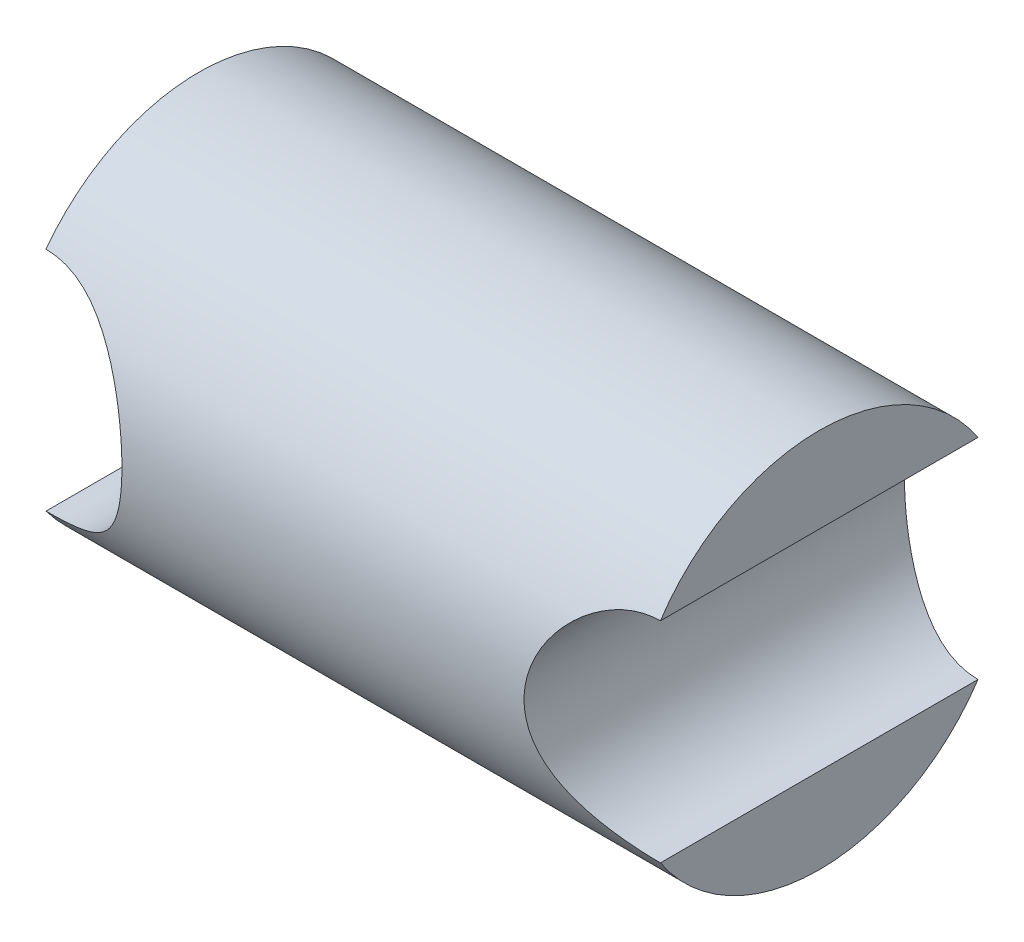
ISO-10303-21;
HEADER;
FILE_DESCRIPTION(('STEP AP214'),'2;1');
FILE_NAME('part.step','',(''),(''),'','','');
FILE_SCHEMA(('AUTOMOTIVE_DESIGN { 1 0 10303 214 1 1 1 1 }'));
ENDSEC;
DATA;
#1=APPLICATION_CONTEXT('core data for automotive mechanical design processes');
#2=APPLICATION_PROTOCOL_DEFINITION('international standard','automotive_design',2000,#1);
#3=PRODUCT_CONTEXT('',#1,'mechanical');
#4=PRODUCT('Part','Part','',(#3));
#5=PRODUCT_RELATED_PRODUCT_CATEGORY('part','',(#4));
#6=PRODUCT_DEFINITION_FORMATION('','',#4);
#7=PRODUCT_DEFINITION_CONTEXT('part definition',#1,'design');
#8=PRODUCT_DEFINITION('design','',#6,#7);
#9=PRODUCT_DEFINITION_SHAPE('','',#8);
#10=(LENGTH_UNIT() NAMED_UNIT(*) SI_UNIT(.MILLI.,.METRE.));
#11=(NAMED_UNIT(*) PLANE_ANGLE_UNIT() SI_UNIT($,.RADIAN.));
#12=(NAMED_UNIT(*) SI_UNIT($,.STERADIAN.) SOLID_ANGLE_UNIT());
#13=UNCERTAINTY_MEASURE_WITH_UNIT(LENGTH_MEASURE(1.E-05),#10,'distance_accuracy_value','');
#14=(GEOMETRIC_REPRESENTATION_CONTEXT(3) GLOBAL_UNCERTAINTY_ASSIGNED_CONTEXT((#13)) GLOBAL_UNIT_ASSIGNED_CONTEXT((#10,
#11,#12)) REPRESENTATION_CONTEXT('',''));
#15=CARTESIAN_POINT('',(0.,0.,0.));
#16=DIRECTION('',(0.,0.,1.));
#17=DIRECTION('',(1.,0.,0.));
#18=AXIS2_PLACEMENT_3D('',#15,#16,#17);
#19=CARTESIAN_POINT('',(75.,0.,0.));
#20=DIRECTION('',(-1.,0.,0.));
#21=DIRECTION('',(0.,0.,-1.));
#22=AXIS2_PLACEMENT_3D('',#19,#20,#21);
#23=CYLINDRICAL_SURFACE('',#22,23.);
#24=CARTESIAN_POINT('',(75.,-12.6701406368447,-19.1955082309007));
#25=CARTESIAN_POINT('',(74.8369294760517,-12.6703725699019,-19.1953515760814));
#26=CARTESIAN_POINT('',(74.6738765209561,-12.6674524483349,-19.197283010189));
#27=CARTESIAN_POINT('',(74.348114196428,-12.6553313683796,-19.2052770578598));
#28=CARTESIAN_POINT('',(74.1854048090592,-12.6461307464331,-19.2113394501303));
#29=CARTESIAN_POINT('',(73.6985568130561,-12.6091674984424,-19.2356394955028));
#30=CARTESIAN_POINT('',(73.3753673887891,-12.5720438529932,-19.2599898902889));
#31=CARTESIAN_POINT('',(72.7365402763044,-12.4737340733277,-19.3238021572105));
#32=CARTESIAN_POINT('',(72.4208661148813,-12.4127137929539,-19.3631598233005));
#33=CARTESIAN_POINT('',(71.7969146387665,-12.2674364029484,-19.4555236461787));
#34=CARTESIAN_POINT('',(71.4886384537322,-12.1831757687916,-19.508531873067));
#35=CARTESIAN_POINT('',(70.8822749260622,-11.9927037483855,-19.626195030197));
#36=CARTESIAN_POINT('',(70.5841607617617,-11.8865563719188,-19.6908159288654));
#37=CARTESIAN_POINT('',(69.9986688477942,-11.6532194229001,-19.8297983823622));
#38=CARTESIAN_POINT('',(69.711290885988,-11.5260302663873,-19.9041597445955));
#39=CARTESIAN_POINT('',(69.1479533911269,-11.2513953328332,-20.0606858463557));
#40=CARTESIAN_POINT('',(68.8720148260924,-11.1039143277573,-20.1428640782016));
#41=CARTESIAN_POINT('',(68.3330510519983,-10.7898212572092,-20.3128443216903));
#42=CARTESIAN_POINT('',(68.0700271254207,-10.623207297211,-20.400646889868));
#43=CARTESIAN_POINT('',(67.5320472002041,-10.2540885503507,-20.5888506364099));
#44=CARTESIAN_POINT('',(67.2585425992587,-10.0496599361237,-20.6896318906438));
#45=CARTESIAN_POINT('',(66.7292877351354,-9.61977777649522,-20.8929752916031));
#46=CARTESIAN_POINT('',(66.4735385187119,-9.39432299334598,-20.9955375428808));
#47=CARTESIAN_POINT('',(65.9807669787859,-8.92328506865594,-21.2000218786104));
#48=CARTESIAN_POINT('',(65.743753377776,-8.67769265904466,-21.3019436447907));
#49=CARTESIAN_POINT('',(65.2898249129469,-8.16756587392657,-21.5026970494471));
#50=CARTESIAN_POINT('',(65.0729035275221,-7.90303769443529,-21.6015296836552));
#51=CARTESIAN_POINT('',(64.6422291135284,-7.33203190684531,-21.8023099506229));
#52=CARTESIAN_POINT('',(64.4304217535566,-7.02390983191719,-21.9037708258536));
#53=CARTESIAN_POINT('',(64.0337472676137,-6.38801941808006,-22.0975945369596));
#54=CARTESIAN_POINT('',(63.8488821297613,-6.06024963184464,-22.1899567012607));
#55=CARTESIAN_POINT('',(63.5080953831817,-5.38722484606739,-22.3628807856803));
#56=CARTESIAN_POINT('',(63.3521577454197,-5.0419796656428,-22.4434492355694));
#57=CARTESIAN_POINT('',(63.0710282172252,-4.336284584781,-22.590406469527));
#58=CARTESIAN_POINT('',(62.9458322379202,-3.97583671389746,-22.6567971391942));
#59=CARTESIAN_POINT('',(62.7369692624769,-3.2730161720505,-22.768471919152));
#60=CARTESIAN_POINT('',(62.6507238985723,-2.93161423371946,-22.8150475607307));
#61=CARTESIAN_POINT('',(62.5067491610129,-2.24114936007302,-22.8931849232233));
#62=CARTESIAN_POINT('',(62.4490183550609,-1.89208681047315,-22.9247473982513));
#63=CARTESIAN_POINT('',(62.3629458561969,-1.189506975912,-22.9719167496449));
#64=CARTESIAN_POINT('',(62.3345856510173,-0.835992639322882,-22.9875336763901));
#65=CARTESIAN_POINT('',(62.3076304049422,-0.127498319987761,-23.002374838167));
#66=CARTESIAN_POINT('',(62.3090329698213,0.22748154256914,-23.0016003917803));
#67=CARTESIAN_POINT('',(62.3398484328987,0.898227363427973,-22.9846384450275));
#68=CARTESIAN_POINT('',(62.3662885407636,1.21417673806282,-22.9700867913281));
#69=CARTESIAN_POINT('',(62.4426174189269,1.84235186680296,-22.9282534062329));
#70=CARTESIAN_POINT('',(62.4925041647497,2.15457794000675,-22.900972773909));
#71=CARTESIAN_POINT('',(62.6151403614973,2.77318369984825,-22.8343217506064));
#72=CARTESIAN_POINT('',(62.6878902173517,3.07956328283655,-22.794951145502));
#73=CARTESIAN_POINT('',(62.8554564097879,3.68454083274565,-22.7050147392627));
#74=CARTESIAN_POINT('',(62.9502735971798,3.98313849913948,-22.6544485064819));
#75=CARTESIAN_POINT('',(63.1620685889228,4.5737342542714,-22.5426746053772));
#76=CARTESIAN_POINT('',(63.2792559968547,4.86563804583655,-22.4813667773894));
#77=CARTESIAN_POINT('',(63.5341068521919,5.43824086938055,-22.3497616859956));
#78=CARTESIAN_POINT('',(63.6717701942376,5.71893995900412,-22.2794644688451));
#79=CARTESIAN_POINT('',(63.9664966586428,6.26788151321782,-22.1313012430599));
#80=CARTESIAN_POINT('',(64.1235608783954,6.53612327198848,-22.0534348063323));
#81=CARTESIAN_POINT('',(64.4560739447837,7.05915349220217,-21.8916269153879));
#82=CARTESIAN_POINT('',(64.631529396589,7.31393707042162,-21.8076832819308));
#83=CARTESIAN_POINT('',(65.0195863667303,7.83567958376827,-21.6260582919788));
#84=CARTESIAN_POINT('',(65.2341534660231,8.10100199097447,-21.5278703087243));
#85=CARTESIAN_POINT('',(65.6832934450007,8.6128356989984,-21.3282567873788));
#86=CARTESIAN_POINT('',(65.9178677882192,8.859345621176,-21.2268310127829));
#87=CARTESIAN_POINT('',(66.4061505829152,9.33282750610117,-21.0229599570844));
#88=CARTESIAN_POINT('',(66.6598813984113,9.55977594909528,-20.9205136094736));
#89=CARTESIAN_POINT('',(67.1851465094215,9.99280595101813,-20.7171681348332));
#90=CARTESIAN_POINT('',(67.4566810075925,10.1988872723514,-20.6162690254318));
#91=CARTESIAN_POINT('',(68.0416744355119,10.606675542797,-20.4096854613166));
#92=CARTESIAN_POINT('',(68.3567081972336,10.8063259115961,-20.3043855537698));
#93=CARTESIAN_POINT('',(69.0052598965241,11.1780983946785,-20.1021125366637));
#94=CARTESIAN_POINT('',(69.3387805034574,11.3502165194927,-20.0051406347879));
#95=CARTESIAN_POINT('',(70.0216322363026,11.6647971440948,-19.8233560250293));
#96=CARTESIAN_POINT('',(70.3709202163616,11.8073352306421,-19.7385125023719));
#97=CARTESIAN_POINT('',(71.0838159179697,12.0614765958226,-19.584252176133));
#98=CARTESIAN_POINT('',(71.4474178326634,12.1730922742804,-19.5148291911666));
#99=CARTESIAN_POINT('',(72.0737354153136,12.3346959962137,-19.412918156132));
#100=CARTESIAN_POINT('',(72.3335288024108,12.393104332667,-19.3756172010098));
#101=CARTESIAN_POINT('',(72.8574324774516,12.4935856461336,-19.3109781771066));
#102=CARTESIAN_POINT('',(73.1215415092359,12.5356632912879,-19.2836372613779));
#103=CARTESIAN_POINT('',(73.6538535999065,12.6032043638705,-19.239567873273));
#104=CARTESIAN_POINT('',(73.9220689039334,12.6285998449352,-19.2228828096899));
#105=CARTESIAN_POINT('',(74.4601865058924,12.6622797639718,-19.2006959954634));
#106=CARTESIAN_POINT('',(74.7300897013463,12.6705541530702,-19.1952008125208));
#107=CARTESIAN_POINT('',(75.,12.6701406368447,-19.1955082309007));
#108=B_SPLINE_CURVE_WITH_KNOTS('',3,(#24,#25,#26,#27,#28,#29,#30,#31,#32,#33,#34,#35,#36,#37,
#38,#39,#40,#41,#42,#43,#44,#45,#46,#47,#48,#49,#50,#51,#52,#53,#54,#55,#56,#57,#58,#59,#60,#61,
#62,#63,#64,#65,#66,#67,#68,#69,#70,#71,#72,#73,#74,#75,#76,#77,#78,#79,#80,#81,#82,#83,#84,#85,
#86,#87,#88,#89,#90,#91,#92,#93,#94,#95,#96,#97,#98,#99,#100,#101,#102,#103,#104,#105,#106,
#107),.UNSPECIFIED.,.F.,.F.,(4,2,2,2,2,2,2,2,2,2,2,2,2,2,2,2,2,2,2,2,2,2,2,2,2,2,2,2,2,2,2,2,2,
2,2,2,2,2,2,2,2,4),(0.,0.489121318111132,0.978216436401427,1.95541754270308,2.9259533038266,
3.89663633293911,4.86451978329434,5.83238409888975,6.8019504076495,7.77161280480903,
8.83858314847981,9.90561634120732,10.9731434080519,12.0403227497723,13.2010781423334,
14.3619191459554,15.5221149812596,16.6821564180704,17.7462528188045,18.8102957641309,
19.8736676350518,20.9369539647959,21.8879851064596,22.8389341474032,23.7899000315987,
24.7409025865382,25.7012969313515,26.6616863345961,27.6221300862876,28.5829199688025,
29.6470181256879,30.7111941884156,31.7766324165046,32.8420827744348,34.0032598284113,
35.1646049868051,36.3229449551696,37.4808197569528,38.2868059949857,39.0925616712337,
39.9015791658945,40.7110713622282),.UNSPECIFIED.);
#109=CARTESIAN_POINT('',(75.,-12.6701406368447,-19.1955082309007));
#110=VERTEX_POINT('',#109);
#111=CARTESIAN_POINT('',(75.,12.6701406368447,-19.1955082309007));
#112=VERTEX_POINT('',#111);
#113=EDGE_CURVE('E91',#110,#112,#108,.T.);
#114=ORIENTED_EDGE('',*,*,#113,.F.);
#115=CARTESIAN_POINT('',(75.,0.,0.));
#116=DIRECTION('',(-1.,0.,0.));
#117=DIRECTION('',(0.,0.,1.));
#118=AXIS2_PLACEMENT_3D('',#115,#116,#117);
#119=CIRCLE('',#118,23.);
#120=CARTESIAN_POINT('',(75.,-12.6701406368447,19.1955082309007));
#121=VERTEX_POINT('',#120);
#122=EDGE_CURVE('E45',#110,#121,#119,.T.);
#123=ORIENTED_EDGE('',*,*,#122,.T.);
#124=CARTESIAN_POINT('',(75.,-12.6701406368447,19.1955082309007));
#125=CARTESIAN_POINT('',(74.8369294760517,-12.6703725699019,19.1953515760814));
#126=CARTESIAN_POINT('',(74.6738765209561,-12.6674524483349,19.197283010189));
#127=CARTESIAN_POINT('',(74.348114196428,-12.6553313683796,19.2052770578598));
#128=CARTESIAN_POINT('',(74.1854048090592,-12.6461307464331,19.2113394501303));
#129=CARTESIAN_POINT('',(73.6985568130561,-12.6091674984424,19.2356394955028));
#130=CARTESIAN_POINT('',(73.3753673887891,-12.5720438529932,19.2599898902889));
#131=CARTESIAN_POINT('',(72.7365402763044,-12.4737340733277,19.3238021572105));
#132=CARTESIAN_POINT('',(72.4208661148813,-12.4127137929539,19.3631598233005));
#133=CARTESIAN_POINT('',(71.7969146387665,-12.2674364029484,19.4555236461787));
#134=CARTESIAN_POINT('',(71.4886384537322,-12.1831757687916,19.508531873067));
#135=CARTESIAN_POINT('',(70.8822749260622,-11.9927037483855,19.626195030197));
#136=CARTESIAN_POINT('',(70.5841607617617,-11.8865563719188,19.6908159288654));
#137=CARTESIAN_POINT('',(69.9986688477942,-11.6532194229001,19.8297983823622));
#138=CARTESIAN_POINT('',(69.711290885988,-11.5260302663873,19.9041597445955));
#139=CARTESIAN_POINT('',(69.1479533911269,-11.2513953328332,20.0606858463557));
#140=CARTESIAN_POINT('',(68.8720148260924,-11.1039143277573,20.1428640782016));
#141=CARTESIAN_POINT('',(68.3330510519983,-10.7898212572092,20.3128443216903));
#142=CARTESIAN_POINT('',(68.0700271254207,-10.623207297211,20.400646889868));
#143=CARTESIAN_POINT('',(67.5320472002041,-10.2540885503507,20.5888506364099));
#144=CARTESIAN_POINT('',(67.2585425992587,-10.0496599361237,20.6896318906438));
#145=CARTESIAN_POINT('',(66.7292877351354,-9.61977777649522,20.8929752916031));
#146=CARTESIAN_POINT('',(66.4735385187119,-9.39432299334598,20.9955375428808));
#147=CARTESIAN_POINT('',(65.9807669787859,-8.92328506865594,21.2000218786104));
#148=CARTESIAN_POINT('',(65.743753377776,-8.67769265904466,21.3019436447907));
#149=CARTESIAN_POINT('',(65.2898249129469,-8.16756587392657,21.5026970494471));
#150=CARTESIAN_POINT('',(65.0729035275221,-7.90303769443529,21.6015296836552));
#151=CARTESIAN_POINT('',(64.6422291135284,-7.33203190684531,21.8023099506229));
#152=CARTESIAN_POINT('',(64.4304217535566,-7.02390983191719,21.9037708258536));
#153=CARTESIAN_POINT('',(64.0337472676137,-6.38801941808006,22.0975945369596));
#154=CARTESIAN_POINT('',(63.8488821297613,-6.06024963184464,22.1899567012607));
#155=CARTESIAN_POINT('',(63.5080953831817,-5.38722484606739,22.3628807856803));
#156=CARTESIAN_POINT('',(63.3521577454197,-5.0419796656428,22.4434492355694));
#157=CARTESIAN_POINT('',(63.0710282172252,-4.336284584781,22.590406469527));
#158=CARTESIAN_POINT('',(62.9458322379202,-3.97583671389746,22.6567971391942));
#159=CARTESIAN_POINT('',(62.7369692624769,-3.2730161720505,22.768471919152));
#160=CARTESIAN_POINT('',(62.6507238985723,-2.93161423371946,22.8150475607307));
#161=CARTESIAN_POINT('',(62.5067491610129,-2.24114936007302,22.8931849232233));
#162=CARTESIAN_POINT('',(62.4490183550609,-1.89208681047315,22.9247473982513));
#163=CARTESIAN_POINT('',(62.3629458561969,-1.189506975912,22.9719167496449));
#164=CARTESIAN_POINT('',(62.3345856510173,-0.835992639322882,22.9875336763901));
#165=CARTESIAN_POINT('',(62.3076304049422,-0.127498319987761,23.002374838167));
#166=CARTESIAN_POINT('',(62.3090329698213,0.22748154256914,23.0016003917803));
#167=CARTESIAN_POINT('',(62.3398484328987,0.898227363427973,22.9846384450275));
#168=CARTESIAN_POINT('',(62.3662885407636,1.21417673806282,22.9700867913281));
#169=CARTESIAN_POINT('',(62.4426174189269,1.84235186680296,22.9282534062329));
#170=CARTESIAN_POINT('',(62.4925041647497,2.15457794000675,22.900972773909));
#171=CARTESIAN_POINT('',(62.6151403614973,2.77318369984825,22.8343217506064));
#172=CARTESIAN_POINT('',(62.6878902173517,3.07956328283655,22.794951145502));
#173=CARTESIAN_POINT('',(62.8554564097879,3.68454083274565,22.7050147392627));
#174=CARTESIAN_POINT('',(62.9502735971798,3.98313849913948,22.6544485064819));
#175=CARTESIAN_POINT('',(63.1620685889228,4.5737342542714,22.5426746053772));
#176=CARTESIAN_POINT('',(63.2792559968547,4.86563804583655,22.4813667773894));
#177=CARTESIAN_POINT('',(63.5341068521919,5.43824086938055,22.3497616859956));
#178=CARTESIAN_POINT('',(63.6717701942376,5.71893995900412,22.2794644688451));
#179=CARTESIAN_POINT('',(63.9664966586428,6.26788151321782,22.1313012430599));
#180=CARTESIAN_POINT('',(64.1235608783954,6.53612327198848,22.0534348063323));
#181=CARTESIAN_POINT('',(64.4560739447837,7.05915349220217,21.8916269153879));
#182=CARTESIAN_POINT('',(64.631529396589,7.31393707042162,21.8076832819308));
#183=CARTESIAN_POINT('',(65.0195863667303,7.83567958376827,21.6260582919788));
#184=CARTESIAN_POINT('',(65.2341534660231,8.10100199097447,21.5278703087243));
#185=CARTESIAN_POINT('',(65.6832934450007,8.6128356989984,21.3282567873788));
#186=CARTESIAN_POINT('',(65.9178677882192,8.859345621176,21.2268310127829));
#187=CARTESIAN_POINT('',(66.4061505829152,9.33282750610117,21.0229599570844));
#188=CARTESIAN_POINT('',(66.6598813984113,9.55977594909528,20.9205136094736));
#189=CARTESIAN_POINT('',(67.1851465094215,9.99280595101813,20.7171681348332));
#190=CARTESIAN_POINT('',(67.4566810075925,10.1988872723514,20.6162690254318));
#191=CARTESIAN_POINT('',(68.0416744355119,10.606675542797,20.4096854613166));
#192=CARTESIAN_POINT('',(68.3567081972336,10.8063259115961,20.3043855537698));
#193=CARTESIAN_POINT('',(69.0052598965241,11.1780983946785,20.1021125366637));
#194=CARTESIAN_POINT('',(69.3387805034574,11.3502165194927,20.0051406347879));
#195=CARTESIAN_POINT('',(70.0216322363026,11.6647971440948,19.8233560250293));
#196=CARTESIAN_POINT('',(70.3709202163616,11.8073352306421,19.7385125023719));
#197=CARTESIAN_POINT('',(71.0838159179697,12.0614765958226,19.584252176133));
#198=CARTESIAN_POINT('',(71.4474178326634,12.1730922742804,19.5148291911666));
#199=CARTESIAN_POINT('',(72.0737354153136,12.3346959962137,19.412918156132));
#200=CARTESIAN_POINT('',(72.3335288024108,12.393104332667,19.3756172010098));
#201=CARTESIAN_POINT('',(72.8574324774516,12.4935856461336,19.3109781771066));
#202=CARTESIAN_POINT('',(73.1215415092359,12.5356632912879,19.2836372613779));
#203=CARTESIAN_POINT('',(73.6538535999065,12.6032043638705,19.239567873273));
#204=CARTESIAN_POINT('',(73.9220689039334,12.6285998449352,19.2228828096899));
#205=CARTESIAN_POINT('',(74.4601865058924,12.6622797639718,19.2006959954634));
#206=CARTESIAN_POINT('',(74.7300897013463,12.6705541530702,19.1952008125208));
#207=CARTESIAN_POINT('',(75.,12.6701406368447,19.1955082309007));
#208=B_SPLINE_CURVE_WITH_KNOTS('',3,(#124,#125,#126,#127,#128,#129,#130,#131,#132,#133,#134,
#135,#136,#137,#138,#139,#140,#141,#142,#143,#144,#145,#146,#147,#148,#149,#150,#151,#152,#153,
#154,#155,#156,#157,#158,#159,#160,#161,#162,#163,#164,#165,#166,#167,#168,#169,#170,#171,#172,
#173,#174,#175,#176,#177,#178,#179,#180,#181,#182,#183,#184,#185,#186,#187,#188,#189,#190,#191,
#192,#193,#194,#195,#196,#197,#198,#199,#200,#201,#202,#203,#204,#205,#206,#207),.UNSPECIFIED.,
.F.,.F.,(4,2,2,2,2,2,2,2,2,2,2,2,2,2,2,2,2,2,2,2,2,2,2,2,2,2,2,2,2,2,2,2,2,2,2,2,2,2,2,2,2,4),
(0.,0.489121318111132,0.978216436401427,1.95541754270308,2.9259533038266,3.89663633293911,
4.86451978329434,5.83238409888975,6.8019504076495,7.77161280480903,8.83858314847981,
9.90561634120732,10.9731434080519,12.0403227497723,13.2010781423334,14.3619191459554,
15.5221149812596,16.6821564180704,17.7462528188045,18.8102957641309,19.8736676350518,
20.9369539647959,21.8879851064596,22.8389341474032,23.7899000315987,24.7409025865382,
25.7012969313515,26.6616863345961,27.6221300862876,28.5829199688025,29.6470181256879,
30.7111941884156,31.7766324165046,32.8420827744348,34.0032598284113,35.1646049868051,
36.3229449551696,37.4808197569528,38.2868059949857,39.0925616712337,39.9015791658945,
40.7110713622282),.UNSPECIFIED.);
#209=CARTESIAN_POINT('',(75.,12.6701406368447,19.1955082309007));
#210=VERTEX_POINT('',#209);
#211=EDGE_CURVE('E115',#121,#210,#208,.T.);
#212=ORIENTED_EDGE('',*,*,#211,.T.);
#213=EDGE_CURVE('E11',#210,#112,#119,.T.);
#214=ORIENTED_EDGE('',*,*,#213,.T.);
#215=EDGE_LOOP('',(#114,#123,#212,#214));
#216=FACE_BOUND('',#215,.T.);
#217=CARTESIAN_POINT('',(0.,13.7098613613582,18.4672602584232));
#218=CARTESIAN_POINT('',(0.173631173285071,13.7098634078061,18.467254338337));
#219=CARTESIAN_POINT('',(0.347235637013716,13.7065620587391,18.4697101369709));
#220=CARTESIAN_POINT('',(0.694045896536872,13.6933818638141,18.4794857007419));
#221=CARTESIAN_POINT('',(0.867251718877372,13.6835034694398,18.4868051320133));
#222=CARTESIAN_POINT('',(1.38537422906297,13.6440775478072,18.515946852298));
#223=CARTESIAN_POINT('',(1.72921438733528,13.604739128532,18.5449528521163));
#224=CARTESIAN_POINT('',(2.40822553040273,13.5010313139217,18.6205850801256));
#225=CARTESIAN_POINT('',(2.74344355265676,13.4368621981128,18.6670702420765));
#226=CARTESIAN_POINT('',(3.40578235037971,13.2844441882134,18.7758434399975));
#227=CARTESIAN_POINT('',(3.73290151999934,13.1961905596721,18.8381345828838));
#228=CARTESIAN_POINT('',(4.3759137817575,12.9970969426961,18.9760385579418));
#229=CARTESIAN_POINT('',(4.69184366393033,12.8863410250492,19.0516016663515));
#230=CARTESIAN_POINT('',(5.31221679442057,12.643249032975,19.2137878061221));
#231=CARTESIAN_POINT('',(5.61666038092688,12.5109135945211,19.3004105115275));
#232=CARTESIAN_POINT('',(6.51252017122838,12.0824557962526,19.57367667907));
#233=CARTESIAN_POINT('',(7.08549617289716,11.7551860317354,19.7734975682965));
#234=CARTESIAN_POINT('',(7.93442838314745,11.1866002862225,20.0976467929225));
#235=CARTESIAN_POINT('',(8.23018696835755,10.9707832764498,20.2165267858857));
#236=CARTESIAN_POINT('',(8.80310434782671,10.5166125897946,20.4564595672112));
#237=CARTESIAN_POINT('',(9.08026207629133,10.2782576234111,20.5775124795749));
#238=CARTESIAN_POINT('',(9.61489558964681,9.77996448325967,20.8189574900027));
#239=CARTESIAN_POINT('',(9.87236521324642,9.52001960570189,20.9393493703484));
#240=CARTESIAN_POINT('',(10.3664180174016,8.9795168082751,21.1767657457066));
#241=CARTESIAN_POINT('',(10.6030001639969,8.69895786923851,21.2937900738273));
#242=CARTESIAN_POINT('',(11.0779929135483,8.08726456191373,21.5340493952516));
#243=CARTESIAN_POINT('',(11.3139136966804,7.75392630267136,21.6566180517658));
#244=CARTESIAN_POINT('',(11.7565624619767,7.06478902630954,21.8911221421538));
#245=CARTESIAN_POINT('',(11.9632878239786,6.70898799739515,22.0030566213617));
#246=CARTESIAN_POINT('',(12.3451910743867,5.97718746974276,22.2130145776261));
#247=CARTESIAN_POINT('',(12.5203889942287,5.60120099472727,22.3110468791878));
#248=CARTESIAN_POINT('',(12.8370793232721,4.83143983789782,22.4902924455207));
#249=CARTESIAN_POINT('',(12.9785771864519,4.43766804672712,22.5715084315468));
#250=CARTESIAN_POINT('',(13.2140123667437,3.67349794390084,22.7077413290066));
#251=CARTESIAN_POINT('',(13.3111799565697,3.3044058786306,22.7645084676913));
#252=CARTESIAN_POINT('',(13.4746887674125,2.55720063302673,22.8605018787111));
#253=CARTESIAN_POINT('',(13.5410317582259,2.1790879719221,22.8997291580935));
#254=CARTESIAN_POINT('',(13.6417947238916,1.41745741401439,22.9594559782168));
#255=CARTESIAN_POINT('',(13.6762391890417,1.03394389381358,22.9799698860874));
#256=CARTESIAN_POINT('',(13.7127063179883,0.264847164097725,23.0016910430112));
#257=CARTESIAN_POINT('',(13.7147322168449,-0.120735835061872,23.0029002184905));
#258=CARTESIAN_POINT('',(13.6880876497439,-0.843042781843045,22.9870262050703));
#259=CARTESIAN_POINT('',(13.6631499754101,-1.17996144319744,22.9721674066167));
#260=CARTESIAN_POINT('',(13.5886409132091,-1.85006950685503,22.9279296787651));
#261=CARTESIAN_POINT('',(13.539072028353,-2.1832592845684,22.8985522247472));
#262=CARTESIAN_POINT('',(13.4159198439374,-2.84362915367209,22.8259531597093));
#263=CARTESIAN_POINT('',(13.3423358109881,-3.17080906120684,22.7827311258955));
#264=CARTESIAN_POINT('',(13.1720112821305,-3.81707992025708,22.6834036073774));
#265=CARTESIAN_POINT('',(13.075269835987,-4.13617053924446,22.6272975939992));
#266=CARTESIAN_POINT('',(12.858992709608,-4.7663698137956,22.5030112829041));
#267=CARTESIAN_POINT('',(12.7393199439757,-5.07741700267347,22.4347585553987));
#268=CARTESIAN_POINT('',(12.4787154780764,-5.68789226565015,22.2878097558823));
#269=CARTESIAN_POINT('',(12.337783967387,-5.98732044333295,22.2091137770011));
#270=CARTESIAN_POINT('',(12.035811374531,-6.57329436262611,22.0427896379089));
#271=CARTESIAN_POINT('',(11.8747683129651,-6.85983883242819,21.9551605986533));
#272=CARTESIAN_POINT('',(11.5337068982145,-7.41897353004722,21.772582511671));
#273=CARTESIAN_POINT('',(11.3536865821777,-7.69156231006116,21.6776327070177));
#274=CARTESIAN_POINT('',(10.953338652673,-8.25332110413633,21.4705052646217));
#275=CARTESIAN_POINT('',(10.7307624606249,-8.54062933879437,21.3576193162945));
#276=CARTESIAN_POINT('',(10.2645541327606,-9.09563657375375,21.1272265074239));
#277=CARTESIAN_POINT('',(10.0209205477898,-9.36333422212276,21.0097193291547));
#278=CARTESIAN_POINT('',(9.51340209677736,-9.87858442634789,20.7724367531004));
#279=CARTESIAN_POINT('',(9.24948734366126,-10.1261060996461,20.6526582116539));
#280=CARTESIAN_POINT('',(8.70279276085088,-10.5996467996569,20.4136682220598));
#281=CARTESIAN_POINT('',(8.42001206816732,-10.8256648415748,20.2944568001217));
#282=CARTESIAN_POINT('',(7.80303977436581,-11.2798886352163,20.0459111166419));
#283=CARTESIAN_POINT('',(7.46666955825996,-11.5053794684233,19.9169814640996));
#284=CARTESIAN_POINT('',(6.94653385294067,-11.82146964078,19.7298726831646));
#285=CARTESIAN_POINT('',(6.77054044804799,-11.9231509447541,19.6685449737099));
#286=CARTESIAN_POINT('',(6.41343793290975,-12.1189768365047,19.5484933100602));
#287=CARTESIAN_POINT('',(6.23232669112054,-12.2131182194522,19.4897704677406));
#288=CARTESIAN_POINT('',(5.6829597431414,-12.4832044571888,19.3187709898547));
#289=CARTESIAN_POINT('',(5.30742387118331,-12.647570593384,19.2112079721215));
#290=CARTESIAN_POINT('',(4.53924846948758,-12.9431354946156,19.013336000777));
#291=CARTESIAN_POINT('',(4.14661561298065,-13.0743470667647,18.9230203880537));
#292=CARTESIAN_POINT('',(3.44709625573007,-13.2730916023545,18.7839245263934));
#293=CARTESIAN_POINT('',(3.1433302233867,-13.3483431865178,18.7304057376951));
#294=CARTESIAN_POINT('',(2.52939444826377,-13.4781621583123,18.6372087319558));
#295=CARTESIAN_POINT('',(2.21922681571298,-13.5327362507856,18.5975260287868));
#296=CARTESIAN_POINT('',(1.59222201603777,-13.6207912475583,18.5331344141141));
#297=CARTESIAN_POINT('',(1.27535449687416,-13.6541318711156,18.508525126419));
#298=CARTESIAN_POINT('',(0.798198603671077,-13.6875369695018,18.4838171757518));
#299=CARTESIAN_POINT('',(0.638750633702272,-13.6959043879779,18.477615476042));
#300=CARTESIAN_POINT('',(0.319542004780746,-13.7070675203773,18.4693347444393));
#301=CARTESIAN_POINT('',(0.159781324867908,-13.7098628470573,18.4672559990792));
#302=CARTESIAN_POINT('',(0.,-13.7098613613582,18.4672602584232));
#303=B_SPLINE_CURVE_WITH_KNOTS('',3,(#217,#218,#219,#220,#221,#222,#223,#224,#225,#226,#227,
#228,#229,#230,#231,#232,#233,#234,#235,#236,#237,#238,#239,#240,#241,#242,#243,#244,#245,#246,
#247,#248,#249,#250,#251,#252,#253,#254,#255,#256,#257,#258,#259,#260,#261,#262,#263,#264,#265,
#266,#267,#268,#269,#270,#271,#272,#273,#274,#275,#276,#277,#278,#279,#280,#281,#282,#283,#284,
#285,#286,#287,#288,#289,#290,#291,#292,#293,#294,#295,#296,#297,#298,#299,#300,#301,#302),
.UNSPECIFIED.,.F.,.F.,(4,2,2,2,2,2,2,2,2,2,2,2,2,2,2,2,2,2,2,2,2,2,2,2,2,2,2,2,2,2,2,2,2,2,2,2,
2,2,2,2,2,2,4),(0.,0.520792332404333,1.04154891852634,2.08181184648814,3.11385346515432,
4.14609810533811,5.17455484452049,6.20298127937041,8.26292180850514,9.41690452081353,
10.5709532978292,11.7253617628817,12.8798273408128,14.1572714693302,15.4348301701606,
16.7115742665909,17.9881115956078,19.1440521718772,20.2999263715331,21.4549124038525,
22.6097831789857,23.6230718412105,24.6362575546053,25.6494742122029,26.6627324529965,
27.6822484928894,28.7017554416625,29.7213628105465,30.7410757429475,31.8816012089113,
33.0222052276031,34.1645235606618,35.3068941829408,36.5801182730769,37.2168557904796,
37.8538625312675,39.1233051863038,40.3922567223709,41.3437696056832,42.2949736887428,
43.252398518709,43.7316305759301,44.2108959371498),.UNSPECIFIED.);
#304=CARTESIAN_POINT('',(0.,13.7098613613582,18.4672602584232));
#305=VERTEX_POINT('',#304);
#306=CARTESIAN_POINT('',(0.,-13.7098613613582,18.4672602584232));
#307=VERTEX_POINT('',#306);
#308=EDGE_CURVE('E81',#305,#307,#303,.T.);
#309=ORIENTED_EDGE('',*,*,#308,.T.);
#310=CARTESIAN_POINT('',(0.,0.,0.));
#311=DIRECTION('',(-1.,0.,0.));
#312=DIRECTION('',(0.,0.,1.));
#313=AXIS2_PLACEMENT_3D('',#310,#311,#312);
#314=CIRCLE('',#313,23.);
#315=CARTESIAN_POINT('',(0.,-13.7098613613582,-18.4672602584232));
#316=VERTEX_POINT('',#315);
#317=EDGE_CURVE('E87',#316,#307,#314,.T.);
#318=ORIENTED_EDGE('',*,*,#317,.F.);
#319=CARTESIAN_POINT('',(0.,13.7098613613582,-18.4672602584232));
#320=CARTESIAN_POINT('',(0.173631173285071,13.7098634078061,-18.467254338337));
#321=CARTESIAN_POINT('',(0.347235637013716,13.7065620587391,-18.4697101369709));
#322=CARTESIAN_POINT('',(0.694045896536872,13.6933818638141,-18.4794857007419));
#323=CARTESIAN_POINT('',(0.867251718877372,13.6835034694398,-18.4868051320133));
#324=CARTESIAN_POINT('',(1.38537422906297,13.6440775478072,-18.515946852298));
#325=CARTESIAN_POINT('',(1.72921438733528,13.604739128532,-18.5449528521163));
#326=CARTESIAN_POINT('',(2.40822553040273,13.5010313139217,-18.6205850801256));
#327=CARTESIAN_POINT('',(2.74344355265676,13.4368621981128,-18.6670702420765));
#328=CARTESIAN_POINT('',(3.40578235037971,13.2844441882134,-18.7758434399975));
#329=CARTESIAN_POINT('',(3.73290151999934,13.1961905596721,-18.8381345828838));
#330=CARTESIAN_POINT('',(4.3759137817575,12.9970969426961,-18.9760385579418));
#331=CARTESIAN_POINT('',(4.69184366393033,12.8863410250492,-19.0516016663515));
#332=CARTESIAN_POINT('',(5.31221679442057,12.643249032975,-19.2137878061221));
#333=CARTESIAN_POINT('',(5.61666038092688,12.5109135945211,-19.3004105115275));
#334=CARTESIAN_POINT('',(6.51252017122838,12.0824557962526,-19.57367667907));
#335=CARTESIAN_POINT('',(7.08549617289716,11.7551860317354,-19.7734975682965));
#336=CARTESIAN_POINT('',(7.93442838314745,11.1866002862225,-20.0976467929225));
#337=CARTESIAN_POINT('',(8.23018696835755,10.9707832764498,-20.2165267858857));
#338=CARTESIAN_POINT('',(8.80310434782671,10.5166125897946,-20.4564595672112));
#339=CARTESIAN_POINT('',(9.08026207629133,10.2782576234111,-20.5775124795749));
#340=CARTESIAN_POINT('',(9.61489558964681,9.77996448325967,-20.8189574900027));
#341=CARTESIAN_POINT('',(9.87236521324642,9.52001960570189,-20.9393493703484));
#342=CARTESIAN_POINT('',(10.3664180174016,8.9795168082751,-21.1767657457066));
#343=CARTESIAN_POINT('',(10.6030001639969,8.69895786923851,-21.2937900738273));
#344=CARTESIAN_POINT('',(11.0779929135483,8.08726456191373,-21.5340493952516));
#345=CARTESIAN_POINT('',(11.3139136966804,7.75392630267136,-21.6566180517658));
#346=CARTESIAN_POINT('',(11.7565624619767,7.06478902630954,-21.8911221421538));
#347=CARTESIAN_POINT('',(11.9632878239786,6.70898799739515,-22.0030566213617));
#348=CARTESIAN_POINT('',(12.3451910743867,5.97718746974276,-22.2130145776261));
#349=CARTESIAN_POINT('',(12.5203889942287,5.60120099472727,-22.3110468791878));
#350=CARTESIAN_POINT('',(12.8370793232721,4.83143983789782,-22.4902924455207));
#351=CARTESIAN_POINT('',(12.9785771864519,4.43766804672712,-22.5715084315468));
#352=CARTESIAN_POINT('',(13.2140123667437,3.67349794390084,-22.7077413290066));
#353=CARTESIAN_POINT('',(13.3111799565697,3.3044058786306,-22.7645084676913));
#354=CARTESIAN_POINT('',(13.4746887674125,2.55720063302673,-22.8605018787111));
#355=CARTESIAN_POINT('',(13.5410317582259,2.1790879719221,-22.8997291580935));
#356=CARTESIAN_POINT('',(13.6417947238916,1.41745741401439,-22.9594559782168));
#357=CARTESIAN_POINT('',(13.6762391890417,1.03394389381358,-22.9799698860874));
#358=CARTESIAN_POINT('',(13.7127063179883,0.264847164097725,-23.0016910430112));
#359=CARTESIAN_POINT('',(13.7147322168449,-0.120735835061872,-23.0029002184905));
#360=CARTESIAN_POINT('',(13.6880876497439,-0.843042781843045,-22.9870262050703));
#361=CARTESIAN_POINT('',(13.6631499754101,-1.17996144319744,-22.9721674066167));
#362=CARTESIAN_POINT('',(13.5886409132091,-1.85006950685503,-22.9279296787651));
#363=CARTESIAN_POINT('',(13.539072028353,-2.1832592845684,-22.8985522247472));
#364=CARTESIAN_POINT('',(13.4159198439374,-2.84362915367209,-22.8259531597093));
#365=CARTESIAN_POINT('',(13.3423358109881,-3.17080906120684,-22.7827311258955));
#366=CARTESIAN_POINT('',(13.1720112821305,-3.81707992025708,-22.6834036073774));
#367=CARTESIAN_POINT('',(13.075269835987,-4.13617053924446,-22.6272975939992));
#368=CARTESIAN_POINT('',(12.858992709608,-4.7663698137956,-22.5030112829041));
#369=CARTESIAN_POINT('',(12.7393199439757,-5.07741700267347,-22.4347585553987));
#370=CARTESIAN_POINT('',(12.4787154780764,-5.68789226565015,-22.2878097558823));
#371=CARTESIAN_POINT('',(12.337783967387,-5.98732044333295,-22.2091137770011));
#372=CARTESIAN_POINT('',(12.035811374531,-6.57329436262611,-22.0427896379089));
#373=CARTESIAN_POINT('',(11.8747683129651,-6.85983883242819,-21.9551605986533));
#374=CARTESIAN_POINT('',(11.5337068982145,-7.41897353004722,-21.772582511671));
#375=CARTESIAN_POINT('',(11.3536865821777,-7.69156231006116,-21.6776327070177));
#376=CARTESIAN_POINT('',(10.953338652673,-8.25332110413633,-21.4705052646217));
#377=CARTESIAN_POINT('',(10.7307624606249,-8.54062933879437,-21.3576193162945));
#378=CARTESIAN_POINT('',(10.2645541327606,-9.09563657375375,-21.1272265074239));
#379=CARTESIAN_POINT('',(10.0209205477898,-9.36333422212276,-21.0097193291547));
#380=CARTESIAN_POINT('',(9.51340209677736,-9.87858442634789,-20.7724367531004));
#381=CARTESIAN_POINT('',(9.24948734366126,-10.1261060996461,-20.6526582116539));
#382=CARTESIAN_POINT('',(8.70279276085088,-10.5996467996569,-20.4136682220598));
#383=CARTESIAN_POINT('',(8.42001206816732,-10.8256648415748,-20.2944568001217));
#384=CARTESIAN_POINT('',(7.80303977436581,-11.2798886352163,-20.0459111166419));
#385=CARTESIAN_POINT('',(7.46666955825996,-11.5053794684233,-19.9169814640996));
#386=CARTESIAN_POINT('',(6.94653385294067,-11.82146964078,-19.7298726831646));
#387=CARTESIAN_POINT('',(6.77054044804799,-11.9231509447541,-19.6685449737099));
#388=CARTESIAN_POINT('',(6.41343793290975,-12.1189768365047,-19.5484933100602));
#389=CARTESIAN_POINT('',(6.23232669112054,-12.2131182194522,-19.4897704677406));
#390=CARTESIAN_POINT('',(5.6829597431414,-12.4832044571888,-19.3187709898547));
#391=CARTESIAN_POINT('',(5.30742387118331,-12.647570593384,-19.2112079721215));
#392=CARTESIAN_POINT('',(4.53924846948758,-12.9431354946156,-19.013336000777));
#393=CARTESIAN_POINT('',(4.14661561298065,-13.0743470667647,-18.9230203880537));
#394=CARTESIAN_POINT('',(3.44709625573007,-13.2730916023545,-18.7839245263934));
#395=CARTESIAN_POINT('',(3.1433302233867,-13.3483431865178,-18.7304057376951));
#396=CARTESIAN_POINT('',(2.52939444826377,-13.4781621583123,-18.6372087319558));
#397=CARTESIAN_POINT('',(2.21922681571298,-13.5327362507856,-18.5975260287868));
#398=CARTESIAN_POINT('',(1.59222201603777,-13.6207912475583,-18.5331344141141));
#399=CARTESIAN_POINT('',(1.27535449687416,-13.6541318711156,-18.508525126419));
#400=CARTESIAN_POINT('',(0.798198603671077,-13.6875369695018,-18.4838171757518));
#401=CARTESIAN_POINT('',(0.638750633702272,-13.6959043879779,-18.477615476042));
#402=CARTESIAN_POINT('',(0.319542004780746,-13.7070675203773,-18.4693347444393));
#403=CARTESIAN_POINT('',(0.159781324867908,-13.7098628470573,-18.4672559990792));
#404=CARTESIAN_POINT('',(0.,-13.7098613613582,-18.4672602584232));
#405=B_SPLINE_CURVE_WITH_KNOTS('',3,(#319,#320,#321,#322,#323,#324,#325,#326,#327,#328,#329,
#330,#331,#332,#333,#334,#335,#336,#337,#338,#339,#340,#341,#342,#343,#344,#345,#346,#347,#348,
#349,#350,#351,#352,#353,#354,#355,#356,#357,#358,#359,#360,#361,#362,#363,#364,#365,#366,#367,
#368,#369,#370,#371,#372,#373,#374,#375,#376,#377,#378,#379,#380,#381,#382,#383,#384,#385,#386,
#387,#388,#389,#390,#391,#392,#393,#394,#395,#396,#397,#398,#399,#400,#401,#402,#403,#404),
.UNSPECIFIED.,.F.,.F.,(4,2,2,2,2,2,2,2,2,2,2,2,2,2,2,2,2,2,2,2,2,2,2,2,2,2,2,2,2,2,2,2,2,2,2,2,
2,2,2,2,2,2,4),(0.,0.520792332404333,1.04154891852634,2.08181184648814,3.11385346515432,
4.14609810533811,5.17455484452049,6.20298127937041,8.26292180850514,9.41690452081353,
10.5709532978292,11.7253617628817,12.8798273408128,14.1572714693302,15.4348301701606,
16.7115742665909,17.9881115956078,19.1440521718772,20.2999263715331,21.4549124038525,
22.6097831789857,23.6230718412105,24.6362575546053,25.6494742122029,26.6627324529965,
27.6822484928894,28.7017554416625,29.7213628105465,30.7410757429475,31.8816012089113,
33.0222052276031,34.1645235606618,35.3068941829408,36.5801182730769,37.2168557904796,
37.8538625312675,39.1233051863038,40.3922567223709,41.3437696056832,42.2949736887428,
43.252398518709,43.7316305759301,44.2108959371498),.UNSPECIFIED.);
#406=CARTESIAN_POINT('',(0.,13.7098613613582,-18.4672602584232));
#407=VERTEX_POINT('',#406);
#408=EDGE_CURVE('E83',#407,#316,#405,.T.);
#409=ORIENTED_EDGE('',*,*,#408,.F.);
#410=EDGE_CURVE('E40',#305,#407,#314,.T.);
#411=ORIENTED_EDGE('',*,*,#410,.F.);
#412=EDGE_LOOP('',(#309,#318,#409,#411));
#413=FACE_BOUND('',#412,.T.);
#414=ADVANCED_FACE('F37',(#216,#413),#23,.T.);
#415=CARTESIAN_POINT('',(75.,0.,0.));
#416=DIRECTION('',(1.,0.,0.));
#417=DIRECTION('',(0.,0.,1.));
#418=AXIS2_PLACEMENT_3D('',#415,#416,#417);
#419=PLANE('',#418);
#420=ORIENTED_EDGE('',*,*,#122,.F.);
#421=DIRECTION('',(0.,0.,1.));
#422=VECTOR('',#421,1.);
#423=CARTESIAN_POINT('',(75.,-12.6701406368447,-23.001));
#424=LINE('',#423,#422);
#425=EDGE_CURVE('E94',#110,#121,#424,.T.);
#426=ORIENTED_EDGE('',*,*,#425,.T.);
#427=EDGE_LOOP('',(#420,#426));
#428=FACE_BOUND('',#427,.T.);
#429=ADVANCED_FACE('F143',(#428),#419,.T.);
#430=ORIENTED_EDGE('',*,*,#213,.F.);
#431=DIRECTION('',(0.,0.,1.));
#432=VECTOR('',#431,1.);
#433=CARTESIAN_POINT('',(75.,12.6701406368447,-23.001));
#434=LINE('',#433,#432);
#435=EDGE_CURVE('E52',#210,#112,#434,.F.);
#436=ORIENTED_EDGE('',*,*,#435,.T.);
#437=EDGE_LOOP('',(#430,#436));
#438=FACE_BOUND('',#437,.T.);
#439=ADVANCED_FACE('F139',(#438),#419,.T.);
#440=CARTESIAN_POINT('',(0.,0.,0.));
#441=DIRECTION('',(1.,0.,0.));
#442=DIRECTION('',(0.,0.,1.));
#443=AXIS2_PLACEMENT_3D('',#440,#441,#442);
#444=PLANE('',#443);
#445=DIRECTION('',(0.,0.,1.));
#446=VECTOR('',#445,1.);
#447=CARTESIAN_POINT('',(0.,-13.7098613613582,-23.001));
#448=LINE('',#447,#446);
#449=EDGE_CURVE('E77',#316,#307,#448,.T.);
#450=ORIENTED_EDGE('',*,*,#449,.F.);
#451=ORIENTED_EDGE('',*,*,#317,.T.);
#452=EDGE_LOOP('',(#450,#451));
#453=FACE_BOUND('',#452,.T.);
#454=ADVANCED_FACE('F88',(#453),#444,.F.);
#455=DIRECTION('',(0.,0.,1.));
#456=VECTOR('',#455,1.);
#457=CARTESIAN_POINT('',(0.,13.7098613613582,-23.001));
#458=LINE('',#457,#456);
#459=EDGE_CURVE('E60',#305,#407,#458,.F.);
#460=ORIENTED_EDGE('',*,*,#459,.F.);
#461=ORIENTED_EDGE('',*,*,#410,.T.);
#462=EDGE_LOOP('',(#460,#461));
#463=FACE_BOUND('',#462,.T.);
#464=ADVANCED_FACE('F145',(#463),#444,.F.);
#465=CARTESIAN_POINT('',(0.,0.,-23.001));
#466=DIRECTION('',(0.,0.,1.));
#467=DIRECTION('',(-1.,0.,0.));
#468=AXIS2_PLACEMENT_3D('',#465,#466,#467);
#469=CYLINDRICAL_SURFACE('',#468,13.7098613613582);
#470=ORIENTED_EDGE('',*,*,#408,.T.);
#471=ORIENTED_EDGE('',*,*,#449,.T.);
#472=ORIENTED_EDGE('',*,*,#308,.F.);
#473=ORIENTED_EDGE('',*,*,#459,.T.);
#474=EDGE_LOOP('',(#470,#471,#472,#473));
#475=FACE_BOUND('',#474,.T.);
#476=ADVANCED_FACE('F79',(#475),#469,.F.);
#477=CARTESIAN_POINT('',(74.9820995167501,0.,-23.001));
#478=DIRECTION('',(0.,0.,1.));
#479=DIRECTION('',(-1.,0.,0.));
#480=AXIS2_PLACEMENT_3D('',#477,#478,#479);
#481=CYLINDRICAL_SURFACE('',#480,12.6701532818164);
#482=ORIENTED_EDGE('',*,*,#425,.F.);
#483=ORIENTED_EDGE('',*,*,#113,.T.);
#484=ORIENTED_EDGE('',*,*,#435,.F.);
#485=ORIENTED_EDGE('',*,*,#211,.F.);
#486=EDGE_LOOP('',(#482,#483,#484,#485));
#487=FACE_BOUND('',#486,.T.);
#488=ADVANCED_FACE('F129',(#487),#481,.F.);
#489=CLOSED_SHELL('',(#414,#429,#439,#454,#464,#476,#488));
#490=MANIFOLD_SOLID_BREP('B2',#489);
#491=ADVANCED_BREP_SHAPE_REPRESENTATION('',(#18,#490),#14);
#492=SHAPE_DEFINITION_REPRESENTATION(#9,#491);
ENDSEC;
END-ISO-10303-21;
